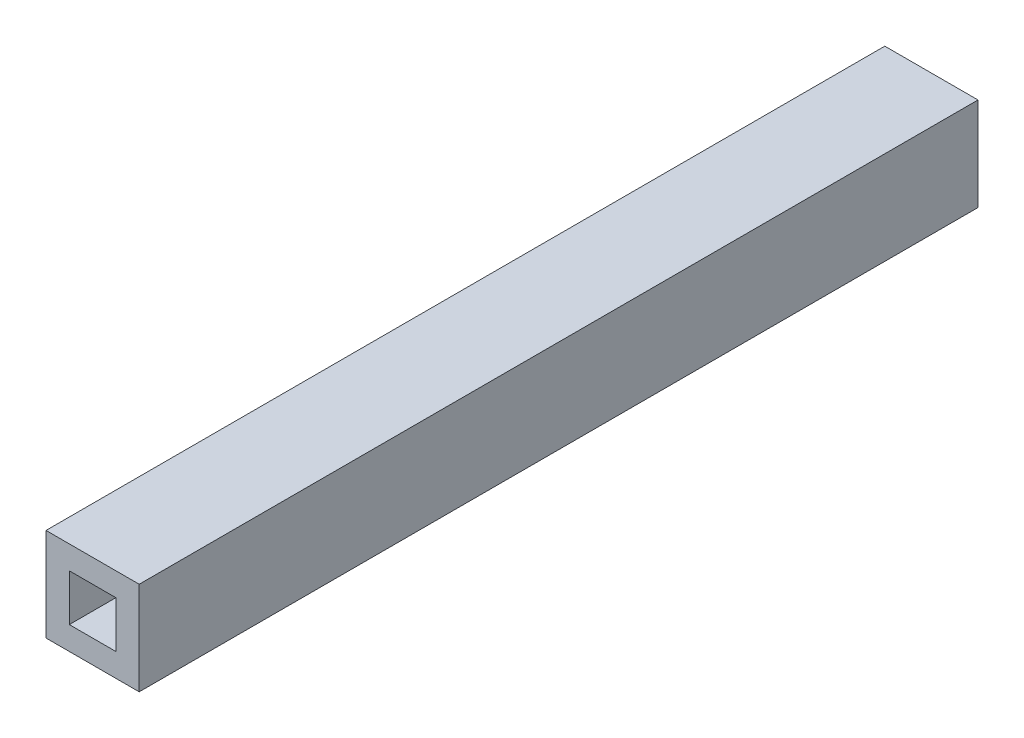
ISO-10303-21;
HEADER;
FILE_DESCRIPTION(('STEP AP214'),'2;1');
FILE_NAME('part.step','',(''),(''),'','','');
FILE_SCHEMA(('AUTOMOTIVE_DESIGN { 1 0 10303 214 1 1 1 1 }'));
ENDSEC;
DATA;
#1=APPLICATION_CONTEXT('core data for automotive mechanical design processes');
#2=APPLICATION_PROTOCOL_DEFINITION('international standard','automotive_design',2000,#1);
#3=PRODUCT_CONTEXT('',#1,'mechanical');
#4=PRODUCT('Part','Part','',(#3));
#5=PRODUCT_RELATED_PRODUCT_CATEGORY('part','',(#4));
#6=PRODUCT_DEFINITION_FORMATION('','',#4);
#7=PRODUCT_DEFINITION_CONTEXT('part definition',#1,'design');
#8=PRODUCT_DEFINITION('design','',#6,#7);
#9=PRODUCT_DEFINITION_SHAPE('','',#8);
#10=(LENGTH_UNIT() NAMED_UNIT(*) SI_UNIT(.MILLI.,.METRE.));
#11=(NAMED_UNIT(*) PLANE_ANGLE_UNIT() SI_UNIT($,.RADIAN.));
#12=(NAMED_UNIT(*) SI_UNIT($,.STERADIAN.) SOLID_ANGLE_UNIT());
#13=UNCERTAINTY_MEASURE_WITH_UNIT(LENGTH_MEASURE(1.E-05),#10,'distance_accuracy_value','');
#14=(GEOMETRIC_REPRESENTATION_CONTEXT(3) GLOBAL_UNCERTAINTY_ASSIGNED_CONTEXT((#13)) GLOBAL_UNIT_ASSIGNED_CONTEXT((#10,
#11,#12)) REPRESENTATION_CONTEXT('',''));
#15=CARTESIAN_POINT('',(0.,0.,0.));
#16=DIRECTION('',(0.,0.,1.));
#17=DIRECTION('',(1.,0.,0.));
#18=AXIS2_PLACEMENT_3D('',#15,#16,#17);
#19=CARTESIAN_POINT('',(0.,0.,180.));
#20=DIRECTION('',(0.,0.,1.));
#21=DIRECTION('',(1.,0.,0.));
#22=AXIS2_PLACEMENT_3D('',#19,#20,#21);
#23=PLANE('',#22);
#24=DIRECTION('',(0.,1.,0.));
#25=VECTOR('',#24,1.);
#26=CARTESIAN_POINT('',(10.,-10.,180.));
#27=LINE('',#26,#25);
#28=CARTESIAN_POINT('',(10.,-10.,180.));
#29=VERTEX_POINT('',#28);
#30=CARTESIAN_POINT('',(10.,10.,180.));
#31=VERTEX_POINT('',#30);
#32=EDGE_CURVE('E158',#29,#31,#27,.T.);
#33=ORIENTED_EDGE('',*,*,#32,.T.);
#34=DIRECTION('',(-1.,0.,0.));
#35=VECTOR('',#34,1.);
#36=CARTESIAN_POINT('',(-10.,10.,180.));
#37=LINE('',#36,#35);
#38=CARTESIAN_POINT('',(-10.,10.,180.));
#39=VERTEX_POINT('',#38);
#40=EDGE_CURVE('E161',#31,#39,#37,.T.);
#41=ORIENTED_EDGE('',*,*,#40,.T.);
#42=DIRECTION('',(0.,-1.,0.));
#43=VECTOR('',#42,1.);
#44=CARTESIAN_POINT('',(-10.,-10.,180.));
#45=LINE('',#44,#43);
#46=CARTESIAN_POINT('',(-10.,-10.,180.));
#47=VERTEX_POINT('',#46);
#48=EDGE_CURVE('E164',#39,#47,#45,.T.);
#49=ORIENTED_EDGE('',*,*,#48,.T.);
#50=DIRECTION('',(1.,0.,0.));
#51=VECTOR('',#50,1.);
#52=CARTESIAN_POINT('',(-10.,-10.,180.));
#53=LINE('',#52,#51);
#54=EDGE_CURVE('E166',#47,#29,#53,.T.);
#55=ORIENTED_EDGE('',*,*,#54,.T.);
#56=EDGE_LOOP('',(#33,#41,#49,#55));
#57=FACE_BOUND('',#56,.T.);
#58=DIRECTION('',(-1.,0.,0.));
#59=VECTOR('',#58,1.);
#60=CARTESIAN_POINT('',(0.,5.,180.));
#61=LINE('',#60,#59);
#62=CARTESIAN_POINT('',(5.,5.,180.));
#63=VERTEX_POINT('',#62);
#64=CARTESIAN_POINT('',(-5.,5.,180.));
#65=VERTEX_POINT('',#64);
#66=EDGE_CURVE('E130',#63,#65,#61,.T.);
#67=ORIENTED_EDGE('',*,*,#66,.F.);
#68=DIRECTION('',(0.,1.,0.));
#69=VECTOR('',#68,1.);
#70=CARTESIAN_POINT('',(5.,0.,180.));
#71=LINE('',#70,#69);
#72=CARTESIAN_POINT('',(5.,-5.,180.));
#73=VERTEX_POINT('',#72);
#74=EDGE_CURVE('E122',#73,#63,#71,.T.);
#75=ORIENTED_EDGE('',*,*,#74,.F.);
#76=DIRECTION('',(1.,0.,0.));
#77=VECTOR('',#76,1.);
#78=CARTESIAN_POINT('',(0.,-5.,180.));
#79=LINE('',#78,#77);
#80=CARTESIAN_POINT('',(-5.,-5.,180.));
#81=VERTEX_POINT('',#80);
#82=EDGE_CURVE('E144',#81,#73,#79,.T.);
#83=ORIENTED_EDGE('',*,*,#82,.F.);
#84=DIRECTION('',(0.,-1.,0.));
#85=VECTOR('',#84,1.);
#86=CARTESIAN_POINT('',(-5.,0.,180.));
#87=LINE('',#86,#85);
#88=EDGE_CURVE('E142',#65,#81,#87,.T.);
#89=ORIENTED_EDGE('',*,*,#88,.F.);
#90=EDGE_LOOP('',(#67,#75,#83,#89));
#91=FACE_BOUND('',#90,.T.);
#92=ADVANCED_FACE('F57',(#57,#91),#23,.T.);
#93=CARTESIAN_POINT('',(0.,0.,0.));
#94=DIRECTION('',(0.,0.,1.));
#95=DIRECTION('',(1.,0.,0.));
#96=AXIS2_PLACEMENT_3D('',#93,#94,#95);
#97=PLANE('',#96);
#98=DIRECTION('',(0.,1.,0.));
#99=VECTOR('',#98,1.);
#100=CARTESIAN_POINT('',(10.,-10.,0.));
#101=LINE('',#100,#99);
#102=CARTESIAN_POINT('',(10.,-10.,0.));
#103=VERTEX_POINT('',#102);
#104=CARTESIAN_POINT('',(10.,10.,0.));
#105=VERTEX_POINT('',#104);
#106=EDGE_CURVE('E138',#103,#105,#101,.T.);
#107=ORIENTED_EDGE('',*,*,#106,.F.);
#108=DIRECTION('',(1.,0.,0.));
#109=VECTOR('',#108,1.);
#110=CARTESIAN_POINT('',(-10.,-10.,0.));
#111=LINE('',#110,#109);
#112=CARTESIAN_POINT('',(-10.,-10.,0.));
#113=VERTEX_POINT('',#112);
#114=EDGE_CURVE('E162',#113,#103,#111,.T.);
#115=ORIENTED_EDGE('',*,*,#114,.F.);
#116=DIRECTION('',(0.,-1.,0.));
#117=VECTOR('',#116,1.);
#118=CARTESIAN_POINT('',(-10.,-10.,0.));
#119=LINE('',#118,#117);
#120=CARTESIAN_POINT('',(-10.,10.,0.));
#121=VERTEX_POINT('',#120);
#122=EDGE_CURVE('E173',#121,#113,#119,.T.);
#123=ORIENTED_EDGE('',*,*,#122,.F.);
#124=DIRECTION('',(-1.,0.,0.));
#125=VECTOR('',#124,1.);
#126=CARTESIAN_POINT('',(-10.,10.,0.));
#127=LINE('',#126,#125);
#128=EDGE_CURVE('E171',#105,#121,#127,.T.);
#129=ORIENTED_EDGE('',*,*,#128,.F.);
#130=EDGE_LOOP('',(#107,#115,#123,#129));
#131=FACE_BOUND('',#130,.T.);
#132=DIRECTION('',(0.,1.,0.));
#133=VECTOR('',#132,1.);
#134=CARTESIAN_POINT('',(5.,0.,0.));
#135=LINE('',#134,#133);
#136=CARTESIAN_POINT('',(5.,-5.,0.));
#137=VERTEX_POINT('',#136);
#138=CARTESIAN_POINT('',(5.,5.,0.));
#139=VERTEX_POINT('',#138);
#140=EDGE_CURVE('E80',#137,#139,#135,.T.);
#141=ORIENTED_EDGE('',*,*,#140,.T.);
#142=DIRECTION('',(-1.,0.,0.));
#143=VECTOR('',#142,1.);
#144=CARTESIAN_POINT('',(0.,5.,0.));
#145=LINE('',#144,#143);
#146=CARTESIAN_POINT('',(-5.,5.,0.));
#147=VERTEX_POINT('',#146);
#148=EDGE_CURVE('E137',#139,#147,#145,.T.);
#149=ORIENTED_EDGE('',*,*,#148,.T.);
#150=DIRECTION('',(0.,-1.,0.));
#151=VECTOR('',#150,1.);
#152=CARTESIAN_POINT('',(-5.,0.,0.));
#153=LINE('',#152,#151);
#154=CARTESIAN_POINT('',(-5.,-5.,0.));
#155=VERTEX_POINT('',#154);
#156=EDGE_CURVE('E150',#147,#155,#153,.T.);
#157=ORIENTED_EDGE('',*,*,#156,.T.);
#158=DIRECTION('',(1.,0.,0.));
#159=VECTOR('',#158,1.);
#160=CARTESIAN_POINT('',(0.,-5.,0.));
#161=LINE('',#160,#159);
#162=EDGE_CURVE('E131',#155,#137,#161,.T.);
#163=ORIENTED_EDGE('',*,*,#162,.T.);
#164=EDGE_LOOP('',(#141,#149,#157,#163));
#165=FACE_BOUND('',#164,.T.);
#166=ADVANCED_FACE('F191',(#131,#165),#97,.F.);
#167=CARTESIAN_POINT('',(10.,-10.,180.));
#168=DIRECTION('',(-1.,0.,0.));
#169=DIRECTION('',(0.,0.,1.));
#170=AXIS2_PLACEMENT_3D('',#167,#168,#169);
#171=PLANE('',#170);
#172=ORIENTED_EDGE('',*,*,#106,.T.);
#173=DIRECTION('',(0.,0.,-1.));
#174=VECTOR('',#173,1.);
#175=CARTESIAN_POINT('',(10.,10.,180.));
#176=LINE('',#175,#174);
#177=EDGE_CURVE('E12',#31,#105,#176,.T.);
#178=ORIENTED_EDGE('',*,*,#177,.F.);
#179=ORIENTED_EDGE('',*,*,#32,.F.);
#180=DIRECTION('',(0.,0.,-1.));
#181=VECTOR('',#180,1.);
#182=CARTESIAN_POINT('',(10.,-10.,180.));
#183=LINE('',#182,#181);
#184=EDGE_CURVE('E168',#29,#103,#183,.T.);
#185=ORIENTED_EDGE('',*,*,#184,.T.);
#186=EDGE_LOOP('',(#172,#178,#179,#185));
#187=FACE_BOUND('',#186,.T.);
#188=ADVANCED_FACE('F59',(#187),#171,.F.);
#189=CARTESIAN_POINT('',(-10.,10.,180.));
#190=DIRECTION('',(0.,-1.,0.));
#191=DIRECTION('',(0.,0.,-1.));
#192=AXIS2_PLACEMENT_3D('',#189,#190,#191);
#193=PLANE('',#192);
#194=ORIENTED_EDGE('',*,*,#128,.T.);
#195=DIRECTION('',(0.,0.,-1.));
#196=VECTOR('',#195,1.);
#197=CARTESIAN_POINT('',(-10.,10.,180.));
#198=LINE('',#197,#196);
#199=EDGE_CURVE('E65',#39,#121,#198,.T.);
#200=ORIENTED_EDGE('',*,*,#199,.F.);
#201=ORIENTED_EDGE('',*,*,#40,.F.);
#202=ORIENTED_EDGE('',*,*,#177,.T.);
#203=EDGE_LOOP('',(#194,#200,#201,#202));
#204=FACE_BOUND('',#203,.T.);
#205=ADVANCED_FACE('F201',(#204),#193,.F.);
#206=CARTESIAN_POINT('',(-10.,-10.,180.));
#207=DIRECTION('',(1.,0.,0.));
#208=DIRECTION('',(0.,0.,-1.));
#209=AXIS2_PLACEMENT_3D('',#206,#207,#208);
#210=PLANE('',#209);
#211=ORIENTED_EDGE('',*,*,#122,.T.);
#212=DIRECTION('',(0.,0.,-1.));
#213=VECTOR('',#212,1.);
#214=CARTESIAN_POINT('',(-10.,-10.,180.));
#215=LINE('',#214,#213);
#216=EDGE_CURVE('E178',#47,#113,#215,.T.);
#217=ORIENTED_EDGE('',*,*,#216,.F.);
#218=ORIENTED_EDGE('',*,*,#48,.F.);
#219=ORIENTED_EDGE('',*,*,#199,.T.);
#220=EDGE_LOOP('',(#211,#217,#218,#219));
#221=FACE_BOUND('',#220,.T.);
#222=ADVANCED_FACE('F185',(#221),#210,.F.);
#223=CARTESIAN_POINT('',(-10.,-10.,180.));
#224=DIRECTION('',(0.,1.,0.));
#225=DIRECTION('',(0.,0.,1.));
#226=AXIS2_PLACEMENT_3D('',#223,#224,#225);
#227=PLANE('',#226);
#228=ORIENTED_EDGE('',*,*,#114,.T.);
#229=ORIENTED_EDGE('',*,*,#184,.F.);
#230=ORIENTED_EDGE('',*,*,#54,.F.);
#231=ORIENTED_EDGE('',*,*,#216,.T.);
#232=EDGE_LOOP('',(#228,#229,#230,#231));
#233=FACE_BOUND('',#232,.T.);
#234=ADVANCED_FACE('F195',(#233),#227,.F.);
#235=CARTESIAN_POINT('',(5.,0.,180.));
#236=DIRECTION('',(-1.,0.,0.));
#237=DIRECTION('',(0.,0.,1.));
#238=AXIS2_PLACEMENT_3D('',#235,#236,#237);
#239=PLANE('',#238);
#240=ORIENTED_EDGE('',*,*,#140,.F.);
#241=DIRECTION('',(0.,0.,-1.));
#242=VECTOR('',#241,1.);
#243=CARTESIAN_POINT('',(5.,-5.,180.));
#244=LINE('',#243,#242);
#245=EDGE_CURVE('E126',#73,#137,#244,.T.);
#246=ORIENTED_EDGE('',*,*,#245,.F.);
#247=ORIENTED_EDGE('',*,*,#74,.T.);
#248=DIRECTION('',(0.,0.,-1.));
#249=VECTOR('',#248,1.);
#250=CARTESIAN_POINT('',(5.,5.,180.));
#251=LINE('',#250,#249);
#252=EDGE_CURVE('E125',#63,#139,#251,.T.);
#253=ORIENTED_EDGE('',*,*,#252,.T.);
#254=EDGE_LOOP('',(#240,#246,#247,#253));
#255=FACE_BOUND('',#254,.T.);
#256=ADVANCED_FACE('F124',(#255),#239,.T.);
#257=CARTESIAN_POINT('',(0.,5.,180.));
#258=DIRECTION('',(0.,-1.,0.));
#259=DIRECTION('',(0.,0.,-1.));
#260=AXIS2_PLACEMENT_3D('',#257,#258,#259);
#261=PLANE('',#260);
#262=ORIENTED_EDGE('',*,*,#148,.F.);
#263=ORIENTED_EDGE('',*,*,#252,.F.);
#264=ORIENTED_EDGE('',*,*,#66,.T.);
#265=DIRECTION('',(0.,0.,-1.));
#266=VECTOR('',#265,1.);
#267=CARTESIAN_POINT('',(-5.,5.,180.));
#268=LINE('',#267,#266);
#269=EDGE_CURVE('E139',#65,#147,#268,.T.);
#270=ORIENTED_EDGE('',*,*,#269,.T.);
#271=EDGE_LOOP('',(#262,#263,#264,#270));
#272=FACE_BOUND('',#271,.T.);
#273=ADVANCED_FACE('F134',(#272),#261,.T.);
#274=CARTESIAN_POINT('',(-5.,0.,180.));
#275=DIRECTION('',(1.,0.,0.));
#276=DIRECTION('',(0.,0.,-1.));
#277=AXIS2_PLACEMENT_3D('',#274,#275,#276);
#278=PLANE('',#277);
#279=ORIENTED_EDGE('',*,*,#156,.F.);
#280=ORIENTED_EDGE('',*,*,#269,.F.);
#281=ORIENTED_EDGE('',*,*,#88,.T.);
#282=DIRECTION('',(0.,0.,-1.));
#283=VECTOR('',#282,1.);
#284=CARTESIAN_POINT('',(-5.,-5.,180.));
#285=LINE('',#284,#283);
#286=EDGE_CURVE('E72',#81,#155,#285,.T.);
#287=ORIENTED_EDGE('',*,*,#286,.T.);
#288=EDGE_LOOP('',(#279,#280,#281,#287));
#289=FACE_BOUND('',#288,.T.);
#290=ADVANCED_FACE('F224',(#289),#278,.T.);
#291=CARTESIAN_POINT('',(0.,-5.,180.));
#292=DIRECTION('',(0.,1.,0.));
#293=DIRECTION('',(0.,0.,1.));
#294=AXIS2_PLACEMENT_3D('',#291,#292,#293);
#295=PLANE('',#294);
#296=ORIENTED_EDGE('',*,*,#162,.F.);
#297=ORIENTED_EDGE('',*,*,#286,.F.);
#298=ORIENTED_EDGE('',*,*,#82,.T.);
#299=ORIENTED_EDGE('',*,*,#245,.T.);
#300=EDGE_LOOP('',(#296,#297,#298,#299));
#301=FACE_BOUND('',#300,.T.);
#302=ADVANCED_FACE('F228',(#301),#295,.T.);
#303=CLOSED_SHELL('',(#92,#166,#188,#205,#222,#234,#256,#273,#290,#302));
#304=MANIFOLD_SOLID_BREP('B2',#303);
#305=ADVANCED_BREP_SHAPE_REPRESENTATION('',(#18,#304),#14);
#306=SHAPE_DEFINITION_REPRESENTATION(#9,#305);
ENDSEC;
END-ISO-10303-21;
